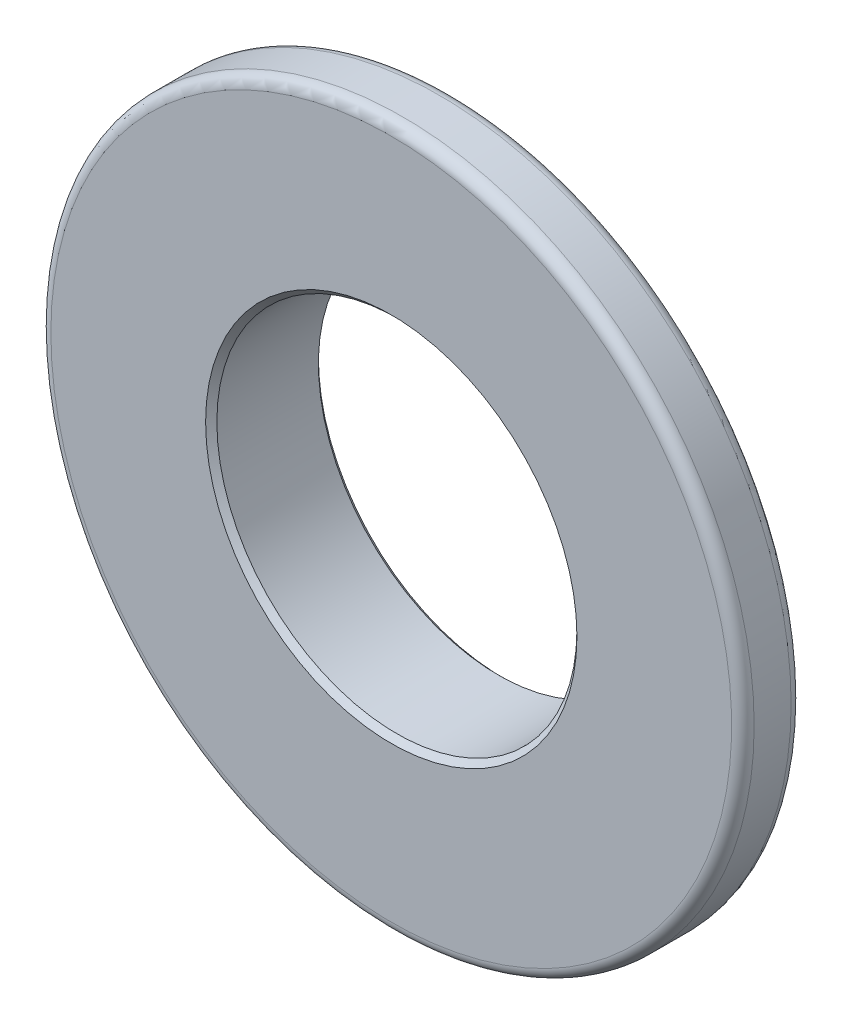
ISO-10303-21;
HEADER;
FILE_DESCRIPTION(('STEP AP214'),'2;1');
FILE_NAME('part.step','',(''),(''),'','','');
FILE_SCHEMA(('AUTOMOTIVE_DESIGN { 1 0 10303 214 1 1 1 1 }'));
ENDSEC;
DATA;
#1=APPLICATION_CONTEXT('core data for automotive mechanical design processes');
#2=APPLICATION_PROTOCOL_DEFINITION('international standard','automotive_design',2000,#1);
#3=PRODUCT_CONTEXT('',#1,'mechanical');
#4=PRODUCT('Part','Part','',(#3));
#5=PRODUCT_RELATED_PRODUCT_CATEGORY('part','',(#4));
#6=PRODUCT_DEFINITION_FORMATION('','',#4);
#7=PRODUCT_DEFINITION_CONTEXT('part definition',#1,'design');
#8=PRODUCT_DEFINITION('design','',#6,#7);
#9=PRODUCT_DEFINITION_SHAPE('','',#8);
#10=(LENGTH_UNIT() NAMED_UNIT(*) SI_UNIT(.MILLI.,.METRE.));
#11=(NAMED_UNIT(*) PLANE_ANGLE_UNIT() SI_UNIT($,.RADIAN.));
#12=(NAMED_UNIT(*) SI_UNIT($,.STERADIAN.) SOLID_ANGLE_UNIT());
#13=UNCERTAINTY_MEASURE_WITH_UNIT(LENGTH_MEASURE(1.E-05),#10,'distance_accuracy_value','');
#14=(GEOMETRIC_REPRESENTATION_CONTEXT(3) GLOBAL_UNCERTAINTY_ASSIGNED_CONTEXT((#13)) GLOBAL_UNIT_ASSIGNED_CONTEXT((#10,
#11,#12)) REPRESENTATION_CONTEXT('',''));
#15=CARTESIAN_POINT('',(0.,0.,0.));
#16=DIRECTION('',(0.,0.,1.));
#17=DIRECTION('',(1.,0.,0.));
#18=AXIS2_PLACEMENT_3D('',#15,#16,#17);
#19=CARTESIAN_POINT('',(0.,0.,0.));
#20=DIRECTION('',(0.,0.,1.));
#21=DIRECTION('',(1.,0.,0.));
#22=AXIS2_PLACEMENT_3D('',#19,#20,#21);
#23=CYLINDRICAL_SURFACE('',#22,15.875);
#24=CARTESIAN_POINT('',(0.,0.,-34.3076343544699));
#25=DIRECTION('',(0.,0.,1.));
#26=DIRECTION('',(1.,0.,0.));
#27=AXIS2_PLACEMENT_3D('',#24,#25,#26);
#28=CIRCLE('',#27,15.875);
#29=CARTESIAN_POINT('',(15.875,0.,-34.3076343544699));
#30=VERTEX_POINT('',#29);
#31=EDGE_CURVE('E67',#30,#30,#28,.T.);
#32=ORIENTED_EDGE('',*,*,#31,.T.);
#33=EDGE_LOOP('',(#32));
#34=FACE_BOUND('',#33,.T.);
#35=CARTESIAN_POINT('',(0.,0.,-32.639));
#36=DIRECTION('',(0.,0.,-1.));
#37=DIRECTION('',(-1.,0.,0.));
#38=AXIS2_PLACEMENT_3D('',#35,#36,#37);
#39=CIRCLE('',#38,15.875);
#40=CARTESIAN_POINT('',(-15.875,0.,-32.639));
#41=VERTEX_POINT('',#40);
#42=EDGE_CURVE('E71',#41,#41,#39,.T.);
#43=ORIENTED_EDGE('',*,*,#42,.T.);
#44=EDGE_LOOP('',(#43));
#45=FACE_BOUND('',#44,.T.);
#46=ADVANCED_FACE('F57',(#34,#45),#23,.T.);
#47=CARTESIAN_POINT('',(0.,15.875,-32.131));
#48=DIRECTION('',(0.,0.,-1.));
#49=DIRECTION('',(-1.,0.,0.));
#50=AXIS2_PLACEMENT_3D('',#47,#48,#49);
#51=PLANE('',#50);
#52=CARTESIAN_POINT('',(0.,0.,-32.131));
#53=DIRECTION('',(0.,0.,-1.));
#54=DIRECTION('',(-1.,0.,0.));
#55=AXIS2_PLACEMENT_3D('',#52,#53,#54);
#56=CIRCLE('',#55,15.367);
#57=CARTESIAN_POINT('',(-15.367,0.,-32.131));
#58=VERTEX_POINT('',#57);
#59=EDGE_CURVE('E11',#58,#58,#56,.F.);
#60=ORIENTED_EDGE('',*,*,#59,.T.);
#61=EDGE_LOOP('',(#60));
#62=FACE_BOUND('',#61,.T.);
#63=CARTESIAN_POINT('',(0.,0.,-32.131));
#64=DIRECTION('',(0.,0.,-1.));
#65=DIRECTION('',(-1.,0.,0.));
#66=AXIS2_PLACEMENT_3D('',#63,#64,#65);
#67=CIRCLE('',#66,8.382);
#68=CARTESIAN_POINT('',(-8.382,0.,-32.131));
#69=VERTEX_POINT('',#68);
#70=EDGE_CURVE('E79',#69,#69,#67,.T.);
#71=ORIENTED_EDGE('',*,*,#70,.T.);
#72=EDGE_LOOP('',(#71));
#73=FACE_BOUND('',#72,.T.);
#74=ADVANCED_FACE('F108',(#62,#73),#51,.F.);
#75=CARTESIAN_POINT('',(0.,0.,0.));
#76=DIRECTION('',(0.,0.,1.));
#77=DIRECTION('',(1.,0.,0.));
#78=AXIS2_PLACEMENT_3D('',#75,#76,#77);
#79=CYLINDRICAL_SURFACE('',#78,8.128);
#80=CARTESIAN_POINT('',(0.,0.,-32.385));
#81=DIRECTION('',(0.,0.,-1.));
#82=DIRECTION('',(-1.,0.,0.));
#83=AXIS2_PLACEMENT_3D('',#80,#81,#82);
#84=CIRCLE('',#83,8.128);
#85=CARTESIAN_POINT('',(-8.128,0.,-32.385));
#86=VERTEX_POINT('',#85);
#87=EDGE_CURVE('E82',#86,#86,#84,.F.);
#88=ORIENTED_EDGE('',*,*,#87,.T.);
#89=EDGE_LOOP('',(#88));
#90=FACE_BOUND('',#89,.T.);
#91=CARTESIAN_POINT('',(0.,0.,-36.9689178866998));
#92=DIRECTION('',(0.,0.,1.));
#93=DIRECTION('',(1.,0.,0.));
#94=AXIS2_PLACEMENT_3D('',#91,#92,#93);
#95=CIRCLE('',#94,8.128);
#96=CARTESIAN_POINT('',(8.128,0.,-36.9689178866998));
#97=VERTEX_POINT('',#96);
#98=EDGE_CURVE('E85',#97,#97,#95,.F.);
#99=ORIENTED_EDGE('',*,*,#98,.T.);
#100=EDGE_LOOP('',(#99));
#101=FACE_BOUND('',#100,.T.);
#102=ADVANCED_FACE('F89',(#90,#101),#79,.F.);
#103=CARTESIAN_POINT('',(0.,0.,0.));
#104=DIRECTION('',(0.,0.,1.));
#105=DIRECTION('',(0.,1.,0.));
#106=AXIS2_PLACEMENT_3D('',#103,#104,#105);
#107=SPHERICAL_SURFACE('',#106,38.1);
#108=CARTESIAN_POINT('',(0.,0.,-34.7712510349357));
#109=DIRECTION('',(0.,0.,1.));
#110=DIRECTION('',(1.,0.,0.));
#111=AXIS2_PLACEMENT_3D('',#108,#109,#110);
#112=CIRCLE('',#111,15.5746621621622);
#113=CARTESIAN_POINT('',(0.,15.5746621621622,-34.7712510349357));
#114=VERTEX_POINT('',#113);
#115=EDGE_CURVE('E63',#114,#114,#112,.F.);
#116=CARTESIAN_POINT('',(0.,0.,-37.176894601492));
#117=DIRECTION('',(0.,0.,1.));
#118=DIRECTION('',(1.,0.,0.));
#119=AXIS2_PLACEMENT_3D('',#116,#117,#118);
#120=CIRCLE('',#119,8.33597671479212);
#121=CARTESIAN_POINT('',(0.,8.3359767147921,-37.176894601492));
#122=VERTEX_POINT('',#121);
#123=EDGE_CURVE('E76',#122,#122,#120,.T.);
#124=CARTESIAN_POINT('',(0.,15.5746621621622,-34.7712510349357));
#125=CARTESIAN_POINT('',(0.,15.5020247769505,-34.8037866163532));
#126=CARTESIAN_POINT('',(0.,15.4292854383737,-34.8360945814366));
#127=CARTESIAN_POINT('',(0.,15.2836057175858,-34.9002540241664));
#128=CARTESIAN_POINT('',(0.,15.2106653353746,-34.9321055018127));
#129=CARTESIAN_POINT('',(0.,15.0645863904138,-34.9953507148991));
#130=CARTESIAN_POINT('',(0.,14.991447827664,-35.0267444503392));
#131=CARTESIAN_POINT('',(0.,14.8449753946211,-35.0890729470262));
#132=CARTESIAN_POINT('',(0.,14.7716415243279,-35.120007708273));
#133=CARTESIAN_POINT('',(0.,14.624781356297,-35.1814170413256));
#134=CARTESIAN_POINT('',(0.,14.5512550585593,-35.2118916131313));
#135=CARTESIAN_POINT('',(0.,14.4040129234481,-35.2723793704728));
#136=CARTESIAN_POINT('',(0.,14.3302970860746,-35.3023925560086));
#137=CARTESIAN_POINT('',(0.,14.1826787669037,-35.3619563620101));
#138=CARTESIAN_POINT('',(0.,14.1087762851064,-35.3915069824758));
#139=CARTESIAN_POINT('',(0.,13.9607875796416,-35.4501444977292));
#140=CARTESIAN_POINT('',(0.,13.8867013559741,-35.479231392517));
#141=CARTESIAN_POINT('',(0.,13.7383480765362,-35.5369403140131));
#142=CARTESIAN_POINT('',(0.,13.6640810207657,-35.5655623407214));
#143=CARTESIAN_POINT('',(0.,13.515368993992,-35.6223404019166));
#144=CARTESIAN_POINT('',(0.,13.4409240229888,-35.6504964364036));
#145=CARTESIAN_POINT('',(0.,13.2918590896073,-35.706341407316));
#146=CARTESIAN_POINT('',(0.,13.217239127229,-35.7340303437414));
#147=CARTESIAN_POINT('',(0.,13.0678271418281,-35.7889400310359));
#148=CARTESIAN_POINT('',(0.,12.9930351188054,-35.8161607819051));
#149=CARTESIAN_POINT('',(0.,12.843281949604,-35.8701330289805));
#150=CARTESIAN_POINT('',(0.,12.7683208034253,-35.8968845251869));
#151=CARTESIAN_POINT('',(0.,12.6182323320426,-35.9499172122605));
#152=CARTESIAN_POINT('',(0.,12.5431050068386,-35.9761984031277));
#153=CARTESIAN_POINT('',(0.,12.3926871280629,-36.0282894473181));
#154=CARTESIAN_POINT('',(0.,12.3173965744911,-36.0540993006413));
#155=CARTESIAN_POINT('',(0.,12.1666551960482,-36.1052466560507));
#156=CARTESIAN_POINT('',(0.,12.0912043711771,-36.1305841581369));
#157=CARTESIAN_POINT('',(0.,11.9401454134985,-36.1807858159313));
#158=CARTESIAN_POINT('',(0.,11.8645372806911,-36.2056499716394));
#159=CARTESIAN_POINT('',(0.,11.7131666766814,-36.2549039601275));
#160=CARTESIAN_POINT('',(0.,11.6374042054792,-36.2792937929073));
#161=CARTESIAN_POINT('',(0.,11.4857279002829,-36.3275981776176));
#162=CARTESIAN_POINT('',(0.,11.4098140662889,-36.3515127295482));
#163=CARTESIAN_POINT('',(0.,11.2578380170572,-36.3988656133057));
#164=CARTESIAN_POINT('',(0.,11.1817758018194,-36.4223039451327));
#165=CARTESIAN_POINT('',(0.,11.029505977476,-36.4687034681329));
#166=CARTESIAN_POINT('',(0.,10.9532983683702,-36.491664659306));
#167=CARTESIAN_POINT('',(0.,10.8007407493768,-36.5371089991879));
#168=CARTESIAN_POINT('',(0.,10.7243907394892,-36.5595921478966));
#169=CARTESIAN_POINT('',(0.,10.5715513176109,-36.6040795198145));
#170=CARTESIAN_POINT('',(0.,10.4950619056203,-36.6260837430236));
#171=CARTESIAN_POINT('',(0.,10.3419466836903,-36.6696123997172));
#172=CARTESIAN_POINT('',(0.,10.2653208737508,-36.6911368332017));
#173=CARTESIAN_POINT('',(0.,10.1119358654341,-36.7337050650642));
#174=CARTESIAN_POINT('',(0.,10.0351766670568,-36.7547488634424));
#175=CARTESIAN_POINT('',(0.,9.88152789661475,-36.7963549985897));
#176=CARTESIAN_POINT('',(0.,9.80463832455,-36.8169173353589));
#177=CARTESIAN_POINT('',(0.,9.65073182660227,-36.8575597396883));
#178=CARTESIAN_POINT('',(0.,9.57371490071929,-36.8776398072485));
#179=CARTESIAN_POINT('',(0.,9.41955672001225,-36.9173168845276));
#180=CARTESIAN_POINT('',(0.,9.34241546518821,-36.9369138942465));
#181=CARTESIAN_POINT('',(0.,9.18801165633658,-36.9756240860844));
#182=CARTESIAN_POINT('',(0.,9.11074910230901,-36.9947372682035));
#183=CARTESIAN_POINT('',(0.,8.95610572963671,-37.0324790544531));
#184=CARTESIAN_POINT('',(0.,8.87872491099199,-37.0511076585837));
#185=CARTESIAN_POINT('',(0.,8.72384804800033,-37.0878795561291));
#186=CARTESIAN_POINT('',(0.,8.64635200365339,-37.106022849544));
#187=CARTESIAN_POINT('',(0.,8.49124773387836,-37.1418234171064));
#188=CARTESIAN_POINT('',(0.,8.41363950845026,-37.1594806912539));
#189=CARTESIAN_POINT('',(0.,8.3359767147921,-37.176894601492));
#190=B_SPLINE_CURVE_WITH_KNOTS('',3,(#124,#125,#126,#127,#128,#129,#130,#131,#132,#133,#134,
#135,#136,#137,#138,#139,#140,#141,#142,#143,#144,#145,#146,#147,#148,#149,#150,#151,#152,#153,
#154,#155,#156,#157,#158,#159,#160,#161,#162,#163,#164,#165,#166,#167,#168,#169,#170,#171,#172,
#173,#174,#175,#176,#177,#178,#179,#180,#181,#182,#183,#184,#185,#186,#187,#188,#189),
.UNSPECIFIED.,.F.,.F.,(4,2,2,2,2,2,2,2,2,2,2,2,2,2,2,2,2,2,2,2,2,2,2,2,2,2,2,2,2,2,2,2,4),(0.,
0.238773108758168,0.477546217516335,0.716319326274505,0.955092435032674,1.19386554379083,
1.432638652549,1.67141176130717,1.91018487006534,2.14895797882351,2.38773108758167,
2.62650419633984,2.865277305098,3.10405041385617,3.34282352261434,3.58159663137251,
3.82036974013067,4.05914284888884,4.29791595764701,4.53668906640518,4.77546217516335,
5.0142352839215,5.25300839267967,5.49178150143784,5.73055461019601,5.96932771895418,
6.20810082771235,6.44687393647052,6.68564704522867,6.92442015398684,7.16319326274501,
7.40196637150318,7.64073948026135),.UNSPECIFIED.);
#191=EDGE_CURVE('BSEAM99',#114,#122,#190,.T.);
#192=ORIENTED_EDGE('',*,*,#115,.T.);
#193=ORIENTED_EDGE('',*,*,#123,.T.);
#194=ORIENTED_EDGE('',*,*,#191,.T.);
#195=ORIENTED_EDGE('',*,*,#191,.F.);
#196=EDGE_LOOP('',(#192,#194,#193,#195));
#197=FACE_BOUND('',#196,.T.);
#198=ADVANCED_FACE('F99',(#197),#107,.T.);
#199=CARTESIAN_POINT('',(0.,0.,-32.385));
#200=DIRECTION('',(0.,0.,1.));
#201=DIRECTION('',(1.,0.,0.));
#202=AXIS2_PLACEMENT_3D('',#199,#200,#201);
#203=CONICAL_SURFACE('',#202,8.128,0.785398163397445);
#204=ORIENTED_EDGE('',*,*,#70,.F.);
#205=EDGE_LOOP('',(#204));
#206=FACE_BOUND('',#205,.T.);
#207=ORIENTED_EDGE('',*,*,#87,.F.);
#208=EDGE_LOOP('',(#207));
#209=FACE_BOUND('',#208,.T.);
#210=ADVANCED_FACE('F95',(#206,#209),#203,.F.);
#211=CARTESIAN_POINT('',(0.,0.,-37.176894601492));
#212=DIRECTION('',(0.,0.,-1.));
#213=DIRECTION('',(-1.,0.,0.));
#214=AXIS2_PLACEMENT_3D('',#211,#212,#213);
#215=CONICAL_SURFACE('',#214,8.33597671479212,0.785398163397423);
#216=ORIENTED_EDGE('',*,*,#98,.F.);
#217=EDGE_LOOP('',(#216));
#218=FACE_BOUND('',#217,.T.);
#219=ORIENTED_EDGE('',*,*,#123,.F.);
#220=EDGE_LOOP('',(#219));
#221=FACE_BOUND('',#220,.T.);
#222=ADVANCED_FACE('F91',(#218,#221),#215,.F.);
#223=CARTESIAN_POINT('',(0.,0.,-34.3076343544699));
#224=DIRECTION('',(0.,0.,1.));
#225=DIRECTION('',(1.,0.,0.));
#226=AXIS2_PLACEMENT_3D('',#223,#224,#225);
#227=TOROIDAL_SURFACE('',#226,15.367,0.508);
#228=ORIENTED_EDGE('',*,*,#115,.F.);
#229=EDGE_LOOP('',(#228));
#230=FACE_BOUND('',#229,.T.);
#231=ORIENTED_EDGE('',*,*,#31,.F.);
#232=EDGE_LOOP('',(#231));
#233=FACE_BOUND('',#232,.T.);
#234=ADVANCED_FACE('F94',(#230,#233),#227,.T.);
#235=CARTESIAN_POINT('',(0.,0.,-32.639));
#236=DIRECTION('',(0.,0.,-1.));
#237=DIRECTION('',(-1.,0.,0.));
#238=AXIS2_PLACEMENT_3D('',#235,#236,#237);
#239=TOROIDAL_SURFACE('',#238,15.367,0.508);
#240=ORIENTED_EDGE('',*,*,#42,.F.);
#241=EDGE_LOOP('',(#240));
#242=FACE_BOUND('',#241,.T.);
#243=ORIENTED_EDGE('',*,*,#59,.F.);
#244=EDGE_LOOP('',(#243));
#245=FACE_BOUND('',#244,.T.);
#246=ADVANCED_FACE('F120',(#242,#245),#239,.T.);
#247=CLOSED_SHELL('',(#46,#74,#102,#198,#210,#222,#234,#246));
#248=MANIFOLD_SOLID_BREP('B2',#247);
#249=ADVANCED_BREP_SHAPE_REPRESENTATION('',(#18,#248),#14);
#250=SHAPE_DEFINITION_REPRESENTATION(#9,#249);
ENDSEC;
END-ISO-10303-21;
